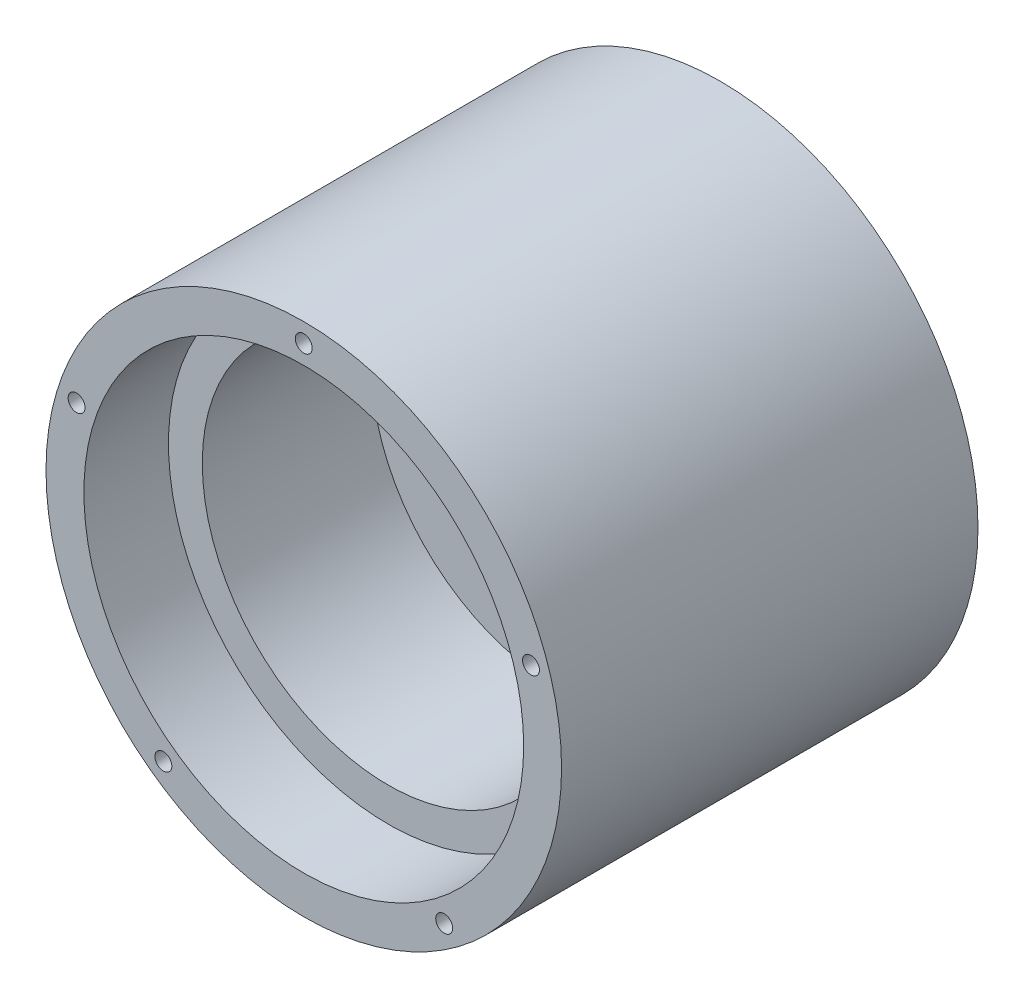
ISO-10303-21;
HEADER;
FILE_DESCRIPTION(('STEP AP214'),'2;1');
FILE_NAME('part.step','',(''),(''),'','','');
FILE_SCHEMA(('AUTOMOTIVE_DESIGN { 1 0 10303 214 1 1 1 1 }'));
ENDSEC;
DATA;
#1=APPLICATION_CONTEXT('core data for automotive mechanical design processes');
#2=APPLICATION_PROTOCOL_DEFINITION('international standard','automotive_design',2000,#1);
#3=PRODUCT_CONTEXT('',#1,'mechanical');
#4=PRODUCT('Part','Part','',(#3));
#5=PRODUCT_RELATED_PRODUCT_CATEGORY('part','',(#4));
#6=PRODUCT_DEFINITION_FORMATION('','',#4);
#7=PRODUCT_DEFINITION_CONTEXT('part definition',#1,'design');
#8=PRODUCT_DEFINITION('design','',#6,#7);
#9=PRODUCT_DEFINITION_SHAPE('','',#8);
#10=(LENGTH_UNIT() NAMED_UNIT(*) SI_UNIT(.MILLI.,.METRE.));
#11=(NAMED_UNIT(*) PLANE_ANGLE_UNIT() SI_UNIT($,.RADIAN.));
#12=(NAMED_UNIT(*) SI_UNIT($,.STERADIAN.) SOLID_ANGLE_UNIT());
#13=UNCERTAINTY_MEASURE_WITH_UNIT(LENGTH_MEASURE(1.E-05),#10,'distance_accuracy_value','');
#14=(GEOMETRIC_REPRESENTATION_CONTEXT(3) GLOBAL_UNCERTAINTY_ASSIGNED_CONTEXT((#13)) GLOBAL_UNIT_ASSIGNED_CONTEXT((#10,
#11,#12)) REPRESENTATION_CONTEXT('',''));
#15=CARTESIAN_POINT('',(0.,0.,0.));
#16=DIRECTION('',(0.,0.,1.));
#17=DIRECTION('',(1.,0.,0.));
#18=AXIS2_PLACEMENT_3D('',#15,#16,#17);
#19=CARTESIAN_POINT('',(0.,0.,85.));
#20=DIRECTION('',(0.,0.,-1.));
#21=DIRECTION('',(-1.,0.,0.));
#22=AXIS2_PLACEMENT_3D('',#19,#20,#21);
#23=CYLINDRICAL_SURFACE('',#22,76.2);
#24=CARTESIAN_POINT('',(0.,0.,85.));
#25=DIRECTION('',(0.,0.,1.));
#26=DIRECTION('',(1.,0.,0.));
#27=AXIS2_PLACEMENT_3D('',#24,#25,#26);
#28=CIRCLE('',#27,76.2);
#29=CARTESIAN_POINT('',(76.2,0.,85.));
#30=VERTEX_POINT('',#29);
#31=EDGE_CURVE('E10',#30,#30,#28,.T.);
#32=ORIENTED_EDGE('',*,*,#31,.F.);
#33=EDGE_LOOP('',(#32));
#34=FACE_BOUND('',#33,.T.);
#35=CARTESIAN_POINT('',(0.,0.,-38.1));
#36=DIRECTION('',(0.,0.,-1.));
#37=DIRECTION('',(-1.,0.,0.));
#38=AXIS2_PLACEMENT_3D('',#35,#36,#37);
#39=CIRCLE('',#38,76.2);
#40=CARTESIAN_POINT('',(-76.2,0.,-38.1));
#41=VERTEX_POINT('',#40);
#42=EDGE_CURVE('E79',#41,#41,#39,.T.);
#43=ORIENTED_EDGE('',*,*,#42,.F.);
#44=EDGE_LOOP('',(#43));
#45=FACE_BOUND('',#44,.T.);
#46=ADVANCED_FACE('F43',(#34,#45),#23,.T.);
#47=CARTESIAN_POINT('',(0.,0.,85.));
#48=DIRECTION('',(0.,0.,1.));
#49=DIRECTION('',(1.,0.,0.));
#50=AXIS2_PLACEMENT_3D('',#47,#48,#49);
#51=PLANE('',#50);
#52=CARTESIAN_POINT('',(-67.1560027286335,21.8203080068036,85.));
#53=DIRECTION('',(0.,0.,1.));
#54=DIRECTION('',(0.309016994374945,0.951056516295155,0.));
#55=AXIS2_PLACEMENT_3D('',#52,#53,#54);
#56=CIRCLE('',#55,2.5);
#57=CARTESIAN_POINT('',(-66.3834602426961,24.1979492975415,85.));
#58=VERTEX_POINT('',#57);
#59=EDGE_CURVE('E93',#58,#58,#56,.T.);
#60=ORIENTED_EDGE('',*,*,#59,.F.);
#61=EDGE_LOOP('',(#60));
#62=FACE_BOUND('',#61,.T.);
#63=CARTESIAN_POINT('',(-41.5046922348758,-57.126308006804,85.));
#64=DIRECTION('',(0.,0.,1.));
#65=DIRECTION('',(-0.809016994374951,0.587785252292469,0.));
#66=AXIS2_PLACEMENT_3D('',#63,#64,#65);
#67=CIRCLE('',#66,2.5);
#68=CARTESIAN_POINT('',(-43.5272347208132,-55.6568448760729,85.));
#69=VERTEX_POINT('',#68);
#70=EDGE_CURVE('E83',#69,#69,#67,.T.);
#71=ORIENTED_EDGE('',*,*,#70,.F.);
#72=EDGE_LOOP('',(#71));
#73=FACE_BOUND('',#72,.T.);
#74=CARTESIAN_POINT('',(41.5046922348766,-57.1263080068034,85.));
#75=DIRECTION('',(0.,0.,1.));
#76=DIRECTION('',(-0.809016994374942,-0.58778525229248,0.));
#77=AXIS2_PLACEMENT_3D('',#74,#75,#76);
#78=CIRCLE('',#77,2.5);
#79=CARTESIAN_POINT('',(39.4821497489393,-58.5957711375346,85.));
#80=VERTEX_POINT('',#79);
#81=EDGE_CURVE('E78',#80,#80,#78,.T.);
#82=ORIENTED_EDGE('',*,*,#81,.F.);
#83=EDGE_LOOP('',(#82));
#84=FACE_BOUND('',#83,.T.);
#85=CARTESIAN_POINT('',(67.1560027286331,21.8203080068045,85.));
#86=DIRECTION('',(0.,0.,1.));
#87=DIRECTION('',(0.309016994374958,-0.95105651629515,0.));
#88=AXIS2_PLACEMENT_3D('',#85,#86,#87);
#89=CIRCLE('',#88,2.5);
#90=CARTESIAN_POINT('',(67.9285452145705,19.4426667160667,85.));
#91=VERTEX_POINT('',#90);
#92=EDGE_CURVE('E75',#91,#91,#89,.T.);
#93=ORIENTED_EDGE('',*,*,#92,.F.);
#94=EDGE_LOOP('',(#93));
#95=FACE_BOUND('',#94,.T.);
#96=CARTESIAN_POINT('',(0.,70.612,85.));
#97=DIRECTION('',(0.,0.,1.));
#98=DIRECTION('',(1.,0.,0.));
#99=AXIS2_PLACEMENT_3D('',#96,#97,#98);
#100=CIRCLE('',#99,2.5);
#101=CARTESIAN_POINT('',(2.5,70.612,85.));
#102=VERTEX_POINT('',#101);
#103=EDGE_CURVE('E68',#102,#102,#100,.T.);
#104=ORIENTED_EDGE('',*,*,#103,.F.);
#105=EDGE_LOOP('',(#104));
#106=FACE_BOUND('',#105,.T.);
#107=CARTESIAN_POINT('',(0.,0.,85.));
#108=DIRECTION('',(0.,0.,1.));
#109=DIRECTION('',(1.,0.,0.));
#110=AXIS2_PLACEMENT_3D('',#107,#108,#109);
#111=CIRCLE('',#110,65.);
#112=CARTESIAN_POINT('',(65.,0.,85.));
#113=VERTEX_POINT('',#112);
#114=EDGE_CURVE('E52',#113,#113,#111,.T.);
#115=ORIENTED_EDGE('',*,*,#114,.F.);
#116=EDGE_LOOP('',(#115));
#117=FACE_BOUND('',#116,.T.);
#118=ORIENTED_EDGE('',*,*,#31,.T.);
#119=EDGE_LOOP('',(#118));
#120=FACE_BOUND('',#119,.T.);
#121=ADVANCED_FACE('F123',(#62,#73,#84,#95,#106,#117,#120),#51,.T.);
#122=CARTESIAN_POINT('',(0.,0.,60.));
#123=DIRECTION('',(0.,0.,1.));
#124=DIRECTION('',(1.,0.,0.));
#125=AXIS2_PLACEMENT_3D('',#122,#123,#124);
#126=CYLINDRICAL_SURFACE('',#125,65.);
#127=CARTESIAN_POINT('',(0.,0.,60.));
#128=DIRECTION('',(0.,0.,1.));
#129=DIRECTION('',(1.,0.,0.));
#130=AXIS2_PLACEMENT_3D('',#127,#128,#129);
#131=CIRCLE('',#130,65.);
#132=CARTESIAN_POINT('',(65.,0.,60.));
#133=VERTEX_POINT('',#132);
#134=EDGE_CURVE('E47',#133,#133,#131,.T.);
#135=ORIENTED_EDGE('',*,*,#134,.F.);
#136=EDGE_LOOP('',(#135));
#137=FACE_BOUND('',#136,.T.);
#138=ORIENTED_EDGE('',*,*,#114,.T.);
#139=EDGE_LOOP('',(#138));
#140=FACE_BOUND('',#139,.T.);
#141=ADVANCED_FACE('F127',(#137,#140),#126,.F.);
#142=CARTESIAN_POINT('',(0.,0.,60.));
#143=DIRECTION('',(0.,0.,1.));
#144=DIRECTION('',(1.,0.,0.));
#145=AXIS2_PLACEMENT_3D('',#142,#143,#144);
#146=PLANE('',#145);
#147=CARTESIAN_POINT('',(0.,0.,60.));
#148=DIRECTION('',(0.,0.,1.));
#149=DIRECTION('',(1.,0.,0.));
#150=AXIS2_PLACEMENT_3D('',#147,#148,#149);
#151=CIRCLE('',#150,55.);
#152=CARTESIAN_POINT('',(55.,0.,60.));
#153=VERTEX_POINT('',#152);
#154=EDGE_CURVE('E58',#153,#153,#151,.T.);
#155=ORIENTED_EDGE('',*,*,#154,.F.);
#156=EDGE_LOOP('',(#155));
#157=FACE_BOUND('',#156,.T.);
#158=ORIENTED_EDGE('',*,*,#134,.T.);
#159=EDGE_LOOP('',(#158));
#160=FACE_BOUND('',#159,.T.);
#161=ADVANCED_FACE('F131',(#157,#160),#146,.T.);
#162=CARTESIAN_POINT('',(0.,0.,10.));
#163=DIRECTION('',(0.,0.,1.));
#164=DIRECTION('',(1.,0.,0.));
#165=AXIS2_PLACEMENT_3D('',#162,#163,#164);
#166=CYLINDRICAL_SURFACE('',#165,55.);
#167=CARTESIAN_POINT('',(0.,0.,10.));
#168=DIRECTION('',(0.,0.,1.));
#169=DIRECTION('',(1.,0.,0.));
#170=AXIS2_PLACEMENT_3D('',#167,#168,#169);
#171=CIRCLE('',#170,55.);
#172=CARTESIAN_POINT('',(55.,0.,10.));
#173=VERTEX_POINT('',#172);
#174=EDGE_CURVE('E59',#173,#173,#171,.T.);
#175=ORIENTED_EDGE('',*,*,#174,.F.);
#176=EDGE_LOOP('',(#175));
#177=FACE_BOUND('',#176,.T.);
#178=ORIENTED_EDGE('',*,*,#154,.T.);
#179=EDGE_LOOP('',(#178));
#180=FACE_BOUND('',#179,.T.);
#181=ADVANCED_FACE('F158',(#177,#180),#166,.F.);
#182=CARTESIAN_POINT('',(0.,0.,10.));
#183=DIRECTION('',(0.,0.,1.));
#184=DIRECTION('',(1.,0.,0.));
#185=AXIS2_PLACEMENT_3D('',#182,#183,#184);
#186=PLANE('',#185);
#187=CARTESIAN_POINT('',(0.,0.,10.));
#188=DIRECTION('',(0.,0.,-1.));
#189=DIRECTION('',(-1.,0.,0.));
#190=AXIS2_PLACEMENT_3D('',#187,#188,#189);
#191=CIRCLE('',#190,25.372140722414);
#192=CARTESIAN_POINT('',(-25.372140722414,0.,10.));
#193=VERTEX_POINT('',#192);
#194=EDGE_CURVE('E96',#193,#193,#191,.T.);
#195=ORIENTED_EDGE('',*,*,#194,.T.);
#196=EDGE_LOOP('',(#195));
#197=FACE_BOUND('',#196,.T.);
#198=ORIENTED_EDGE('',*,*,#174,.T.);
#199=EDGE_LOOP('',(#198));
#200=FACE_BOUND('',#199,.T.);
#201=ADVANCED_FACE('F160',(#197,#200),#186,.T.);
#202=CARTESIAN_POINT('',(0.,70.612,65.));
#203=DIRECTION('',(0.,0.,1.));
#204=DIRECTION('',(1.,0.,0.));
#205=AXIS2_PLACEMENT_3D('',#202,#203,#204);
#206=CYLINDRICAL_SURFACE('',#205,2.5);
#207=CARTESIAN_POINT('',(0.,70.612,65.));
#208=DIRECTION('',(0.,0.,1.));
#209=DIRECTION('',(1.,0.,0.));
#210=AXIS2_PLACEMENT_3D('',#207,#208,#209);
#211=CIRCLE('',#210,2.5);
#212=CARTESIAN_POINT('',(2.5,70.612,65.));
#213=VERTEX_POINT('',#212);
#214=EDGE_CURVE('E64',#213,#213,#211,.T.);
#215=ORIENTED_EDGE('',*,*,#214,.F.);
#216=EDGE_LOOP('',(#215));
#217=FACE_BOUND('',#216,.T.);
#218=ORIENTED_EDGE('',*,*,#103,.T.);
#219=EDGE_LOOP('',(#218));
#220=FACE_BOUND('',#219,.T.);
#221=ADVANCED_FACE('F159',(#217,#220),#206,.F.);
#222=CARTESIAN_POINT('',(0.,70.612,65.));
#223=DIRECTION('',(0.,0.,1.));
#224=DIRECTION('',(1.,0.,0.));
#225=AXIS2_PLACEMENT_3D('',#222,#223,#224);
#226=PLANE('',#225);
#227=ORIENTED_EDGE('',*,*,#214,.T.);
#228=EDGE_LOOP('',(#227));
#229=FACE_BOUND('',#228,.T.);
#230=ADVANCED_FACE('F174',(#229),#226,.T.);
#231=CARTESIAN_POINT('',(67.1560027286331,21.8203080068045,65.));
#232=DIRECTION('',(0.,0.,1.));
#233=DIRECTION('',(1.,0.,0.));
#234=AXIS2_PLACEMENT_3D('',#231,#232,#233);
#235=CYLINDRICAL_SURFACE('',#234,2.5);
#236=CARTESIAN_POINT('',(67.1560027286331,21.8203080068045,65.));
#237=DIRECTION('',(0.,0.,1.));
#238=DIRECTION('',(0.309016994374958,-0.95105651629515,0.));
#239=AXIS2_PLACEMENT_3D('',#236,#237,#238);
#240=CIRCLE('',#239,2.5);
#241=CARTESIAN_POINT('',(67.9285452145705,19.4426667160667,65.));
#242=VERTEX_POINT('',#241);
#243=EDGE_CURVE('E74',#242,#242,#240,.T.);
#244=ORIENTED_EDGE('',*,*,#243,.F.);
#245=EDGE_LOOP('',(#244));
#246=FACE_BOUND('',#245,.T.);
#247=ORIENTED_EDGE('',*,*,#92,.T.);
#248=EDGE_LOOP('',(#247));
#249=FACE_BOUND('',#248,.T.);
#250=ADVANCED_FACE('F178',(#246,#249),#235,.F.);
#251=CARTESIAN_POINT('',(67.1560027286331,21.8203080068045,65.));
#252=DIRECTION('',(0.,0.,1.));
#253=DIRECTION('',(0.309016994374958,-0.95105651629515,0.));
#254=AXIS2_PLACEMENT_3D('',#251,#252,#253);
#255=PLANE('',#254);
#256=ORIENTED_EDGE('',*,*,#243,.T.);
#257=EDGE_LOOP('',(#256));
#258=FACE_BOUND('',#257,.T.);
#259=ADVANCED_FACE('F181',(#258),#255,.T.);
#260=CARTESIAN_POINT('',(41.5046922348766,-57.1263080068034,65.));
#261=DIRECTION('',(0.,0.,1.));
#262=DIRECTION('',(1.,0.,0.));
#263=AXIS2_PLACEMENT_3D('',#260,#261,#262);
#264=CYLINDRICAL_SURFACE('',#263,2.5);
#265=CARTESIAN_POINT('',(41.5046922348766,-57.1263080068034,65.));
#266=DIRECTION('',(0.,0.,1.));
#267=DIRECTION('',(-0.809016994374942,-0.58778525229248,0.));
#268=AXIS2_PLACEMENT_3D('',#265,#266,#267);
#269=CIRCLE('',#268,2.5);
#270=CARTESIAN_POINT('',(39.4821497489393,-58.5957711375346,65.));
#271=VERTEX_POINT('',#270);
#272=EDGE_CURVE('E85',#271,#271,#269,.T.);
#273=ORIENTED_EDGE('',*,*,#272,.F.);
#274=EDGE_LOOP('',(#273));
#275=FACE_BOUND('',#274,.T.);
#276=ORIENTED_EDGE('',*,*,#81,.T.);
#277=EDGE_LOOP('',(#276));
#278=FACE_BOUND('',#277,.T.);
#279=ADVANCED_FACE('F190',(#275,#278),#264,.F.);
#280=CARTESIAN_POINT('',(41.5046922348766,-57.1263080068034,65.));
#281=DIRECTION('',(0.,0.,1.));
#282=DIRECTION('',(-0.809016994374942,-0.58778525229248,0.));
#283=AXIS2_PLACEMENT_3D('',#280,#281,#282);
#284=PLANE('',#283);
#285=ORIENTED_EDGE('',*,*,#272,.T.);
#286=EDGE_LOOP('',(#285));
#287=FACE_BOUND('',#286,.T.);
#288=ADVANCED_FACE('F191',(#287),#284,.T.);
#289=CARTESIAN_POINT('',(-41.5046922348758,-57.126308006804,65.));
#290=DIRECTION('',(0.,0.,1.));
#291=DIRECTION('',(1.,0.,0.));
#292=AXIS2_PLACEMENT_3D('',#289,#290,#291);
#293=CYLINDRICAL_SURFACE('',#292,2.5);
#294=CARTESIAN_POINT('',(-41.5046922348758,-57.126308006804,65.));
#295=DIRECTION('',(0.,0.,1.));
#296=DIRECTION('',(-0.809016994374951,0.587785252292469,0.));
#297=AXIS2_PLACEMENT_3D('',#294,#295,#296);
#298=CIRCLE('',#297,2.5);
#299=CARTESIAN_POINT('',(-43.5272347208132,-55.6568448760729,65.));
#300=VERTEX_POINT('',#299);
#301=EDGE_CURVE('E89',#300,#300,#298,.T.);
#302=ORIENTED_EDGE('',*,*,#301,.F.);
#303=EDGE_LOOP('',(#302));
#304=FACE_BOUND('',#303,.T.);
#305=ORIENTED_EDGE('',*,*,#70,.T.);
#306=EDGE_LOOP('',(#305));
#307=FACE_BOUND('',#306,.T.);
#308=ADVANCED_FACE('F194',(#304,#307),#293,.F.);
#309=CARTESIAN_POINT('',(-41.5046922348758,-57.126308006804,65.));
#310=DIRECTION('',(0.,0.,1.));
#311=DIRECTION('',(-0.809016994374951,0.587785252292469,0.));
#312=AXIS2_PLACEMENT_3D('',#309,#310,#311);
#313=PLANE('',#312);
#314=ORIENTED_EDGE('',*,*,#301,.T.);
#315=EDGE_LOOP('',(#314));
#316=FACE_BOUND('',#315,.T.);
#317=ADVANCED_FACE('F197',(#316),#313,.T.);
#318=CARTESIAN_POINT('',(-67.1560027286335,21.8203080068036,65.));
#319=DIRECTION('',(0.,0.,1.));
#320=DIRECTION('',(1.,0.,0.));
#321=AXIS2_PLACEMENT_3D('',#318,#319,#320);
#322=CYLINDRICAL_SURFACE('',#321,2.5);
#323=CARTESIAN_POINT('',(-67.1560027286335,21.8203080068036,65.));
#324=DIRECTION('',(0.,0.,1.));
#325=DIRECTION('',(0.309016994374945,0.951056516295155,0.));
#326=AXIS2_PLACEMENT_3D('',#323,#324,#325);
#327=CIRCLE('',#326,2.5);
#328=CARTESIAN_POINT('',(-66.3834602426961,24.1979492975415,65.));
#329=VERTEX_POINT('',#328);
#330=EDGE_CURVE('E70',#329,#329,#327,.T.);
#331=ORIENTED_EDGE('',*,*,#330,.F.);
#332=EDGE_LOOP('',(#331));
#333=FACE_BOUND('',#332,.T.);
#334=ORIENTED_EDGE('',*,*,#59,.T.);
#335=EDGE_LOOP('',(#334));
#336=FACE_BOUND('',#335,.T.);
#337=ADVANCED_FACE('F202',(#333,#336),#322,.F.);
#338=CARTESIAN_POINT('',(-67.1560027286335,21.8203080068036,65.));
#339=DIRECTION('',(0.,0.,1.));
#340=DIRECTION('',(0.309016994374945,0.951056516295155,0.));
#341=AXIS2_PLACEMENT_3D('',#338,#339,#340);
#342=PLANE('',#341);
#343=ORIENTED_EDGE('',*,*,#330,.T.);
#344=EDGE_LOOP('',(#343));
#345=FACE_BOUND('',#344,.T.);
#346=ADVANCED_FACE('F118',(#345),#342,.T.);
#347=CARTESIAN_POINT('',(0.,0.,-38.1));
#348=DIRECTION('',(0.,0.,-1.));
#349=DIRECTION('',(-1.,0.,0.));
#350=AXIS2_PLACEMENT_3D('',#347,#348,#349);
#351=PLANE('',#350);
#352=CARTESIAN_POINT('',(0.,0.,-38.1));
#353=DIRECTION('',(0.,0.,-1.));
#354=DIRECTION('',(-1.,0.,0.));
#355=AXIS2_PLACEMENT_3D('',#352,#353,#354);
#356=CIRCLE('',#355,63.5929937337428);
#357=CARTESIAN_POINT('',(-63.5929937337428,0.,-38.1));
#358=VERTEX_POINT('',#357);
#359=EDGE_CURVE('E107',#358,#358,#356,.T.);
#360=ORIENTED_EDGE('',*,*,#359,.F.);
#361=EDGE_LOOP('',(#360));
#362=FACE_BOUND('',#361,.T.);
#363=ORIENTED_EDGE('',*,*,#42,.T.);
#364=EDGE_LOOP('',(#363));
#365=FACE_BOUND('',#364,.T.);
#366=ADVANCED_FACE('F114',(#362,#365),#351,.T.);
#367=CARTESIAN_POINT('',(0.,0.,-38.1));
#368=DIRECTION('',(0.,0.,-1.));
#369=DIRECTION('',(-1.,0.,0.));
#370=AXIS2_PLACEMENT_3D('',#367,#368,#369);
#371=CYLINDRICAL_SURFACE('',#370,25.372140722414);
#372=CARTESIAN_POINT('',(0.,0.,0.));
#373=DIRECTION('',(0.,0.,-1.));
#374=DIRECTION('',(-1.,0.,0.));
#375=AXIS2_PLACEMENT_3D('',#372,#373,#374);
#376=CIRCLE('',#375,25.372140722414);
#377=CARTESIAN_POINT('',(-25.372140722414,0.,0.));
#378=VERTEX_POINT('',#377);
#379=EDGE_CURVE('E104',#378,#378,#376,.T.);
#380=ORIENTED_EDGE('',*,*,#379,.T.);
#381=EDGE_LOOP('',(#380));
#382=FACE_BOUND('',#381,.T.);
#383=ORIENTED_EDGE('',*,*,#194,.F.);
#384=EDGE_LOOP('',(#383));
#385=FACE_BOUND('',#384,.T.);
#386=ADVANCED_FACE('F120',(#382,#385),#371,.F.);
#387=CARTESIAN_POINT('',(0.,0.,-38.1));
#388=DIRECTION('',(0.,0.,-1.));
#389=DIRECTION('',(-1.,0.,0.));
#390=AXIS2_PLACEMENT_3D('',#387,#388,#389);
#391=CYLINDRICAL_SURFACE('',#390,63.5929937337428);
#392=ORIENTED_EDGE('',*,*,#359,.T.);
#393=EDGE_LOOP('',(#392));
#394=FACE_BOUND('',#393,.T.);
#395=CARTESIAN_POINT('',(0.,0.,0.));
#396=DIRECTION('',(0.,0.,-1.));
#397=DIRECTION('',(-1.,0.,0.));
#398=AXIS2_PLACEMENT_3D('',#395,#396,#397);
#399=CIRCLE('',#398,63.5929937337428);
#400=CARTESIAN_POINT('',(-63.5929937337428,0.,0.));
#401=VERTEX_POINT('',#400);
#402=EDGE_CURVE('E103',#401,#401,#399,.T.);
#403=ORIENTED_EDGE('',*,*,#402,.F.);
#404=EDGE_LOOP('',(#403));
#405=FACE_BOUND('',#404,.T.);
#406=ADVANCED_FACE('F113',(#394,#405),#391,.F.);
#407=CARTESIAN_POINT('',(0.,0.,0.));
#408=DIRECTION('',(0.,0.,1.));
#409=DIRECTION('',(1.,0.,0.));
#410=AXIS2_PLACEMENT_3D('',#407,#408,#409);
#411=PLANE('',#410);
#412=ORIENTED_EDGE('',*,*,#379,.F.);
#413=EDGE_LOOP('',(#412));
#414=FACE_BOUND('',#413,.T.);
#415=ORIENTED_EDGE('',*,*,#402,.T.);
#416=EDGE_LOOP('',(#415));
#417=FACE_BOUND('',#416,.T.);
#418=ADVANCED_FACE('F138',(#414,#417),#411,.F.);
#419=CLOSED_SHELL('',(#46,#121,#141,#161,#181,#201,#221,#230,#250,#259,#279,#288,#308,#317,#337,
#346,#366,#386,#406,#418));
#420=MANIFOLD_SOLID_BREP('B2',#419);
#421=ADVANCED_BREP_SHAPE_REPRESENTATION('',(#18,#420),#14);
#422=SHAPE_DEFINITION_REPRESENTATION(#9,#421);
ENDSEC;
END-ISO-10303-21;
